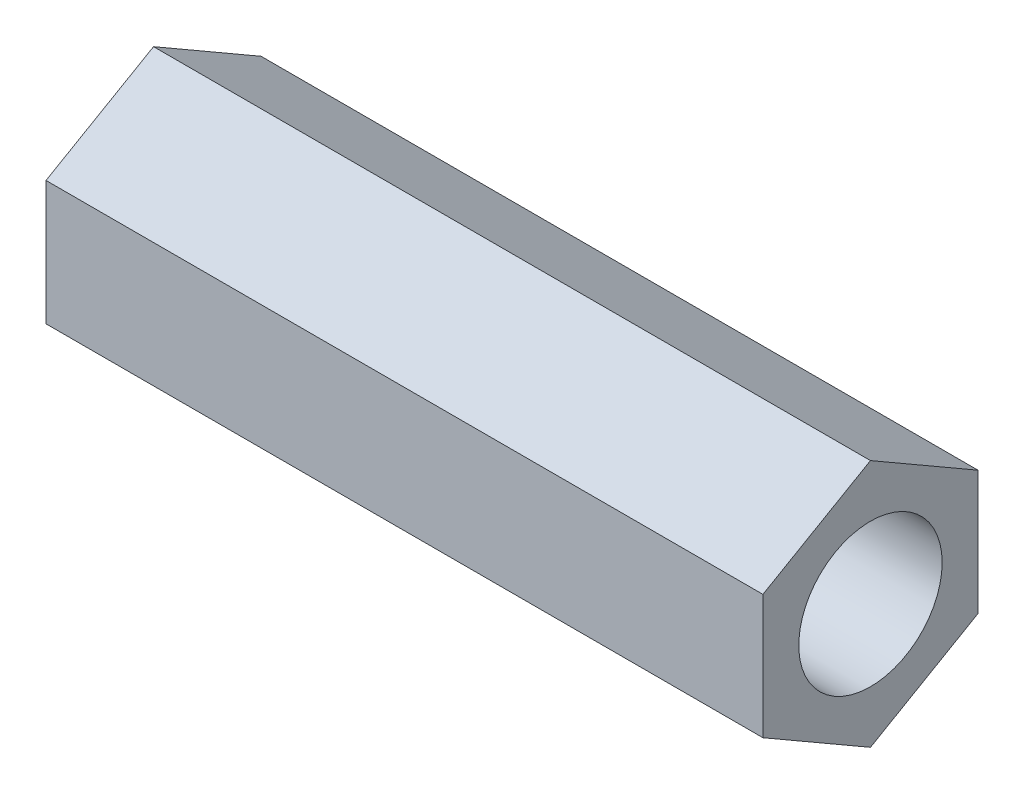
ISO-10303-21;
HEADER;
FILE_DESCRIPTION(('STEP AP214'),'2;1');
FILE_NAME('part.step','',(''),(''),'','','');
FILE_SCHEMA(('AUTOMOTIVE_DESIGN { 1 0 10303 214 1 1 1 1 }'));
ENDSEC;
DATA;
#1=APPLICATION_CONTEXT('core data for automotive mechanical design processes');
#2=APPLICATION_PROTOCOL_DEFINITION('international standard','automotive_design',2000,#1);
#3=PRODUCT_CONTEXT('',#1,'mechanical');
#4=PRODUCT('Part','Part','',(#3));
#5=PRODUCT_RELATED_PRODUCT_CATEGORY('part','',(#4));
#6=PRODUCT_DEFINITION_FORMATION('','',#4);
#7=PRODUCT_DEFINITION_CONTEXT('part definition',#1,'design');
#8=PRODUCT_DEFINITION('design','',#6,#7);
#9=PRODUCT_DEFINITION_SHAPE('','',#8);
#10=(LENGTH_UNIT() NAMED_UNIT(*) SI_UNIT(.MILLI.,.METRE.));
#11=(NAMED_UNIT(*) PLANE_ANGLE_UNIT() SI_UNIT($,.RADIAN.));
#12=(NAMED_UNIT(*) SI_UNIT($,.STERADIAN.) SOLID_ANGLE_UNIT());
#13=UNCERTAINTY_MEASURE_WITH_UNIT(LENGTH_MEASURE(1.E-05),#10,'distance_accuracy_value','');
#14=(GEOMETRIC_REPRESENTATION_CONTEXT(3) GLOBAL_UNCERTAINTY_ASSIGNED_CONTEXT((#13)) GLOBAL_UNIT_ASSIGNED_CONTEXT((#10,
#11,#12)) REPRESENTATION_CONTEXT('',''));
#15=CARTESIAN_POINT('',(0.,0.,0.));
#16=DIRECTION('',(0.,0.,1.));
#17=DIRECTION('',(1.,0.,0.));
#18=AXIS2_PLACEMENT_3D('',#15,#16,#17);
#19=CARTESIAN_POINT('',(20.,0.,0.));
#20=DIRECTION('',(1.,0.,0.));
#21=DIRECTION('',(0.,0.,-1.));
#22=AXIS2_PLACEMENT_3D('',#19,#20,#21);
#23=PLANE('',#22);
#24=DIRECTION('',(0.,0.5,0.866025403784439));
#25=VECTOR('',#24,1.);
#26=CARTESIAN_POINT('',(20.,1.73205080756888,-3.));
#27=LINE('',#26,#25);
#28=CARTESIAN_POINT('',(20.,1.73205080756888,-3.));
#29=VERTEX_POINT('',#28);
#30=CARTESIAN_POINT('',(20.,3.46410161513776,0.));
#31=VERTEX_POINT('',#30);
#32=EDGE_CURVE('E128',#29,#31,#27,.T.);
#33=ORIENTED_EDGE('',*,*,#32,.T.);
#34=DIRECTION('',(0.,-0.5,0.866025403784439));
#35=VECTOR('',#34,1.);
#36=CARTESIAN_POINT('',(20.,3.46410161513776,0.));
#37=LINE('',#36,#35);
#38=CARTESIAN_POINT('',(20.,1.73205080756888,3.));
#39=VERTEX_POINT('',#38);
#40=EDGE_CURVE('E86',#31,#39,#37,.T.);
#41=ORIENTED_EDGE('',*,*,#40,.T.);
#42=DIRECTION('',(0.,-1.,0.));
#43=VECTOR('',#42,1.);
#44=CARTESIAN_POINT('',(20.,1.73205080756888,3.));
#45=LINE('',#44,#43);
#46=CARTESIAN_POINT('',(20.,-1.73205080756888,3.));
#47=VERTEX_POINT('',#46);
#48=EDGE_CURVE('E99',#39,#47,#45,.T.);
#49=ORIENTED_EDGE('',*,*,#48,.T.);
#50=DIRECTION('',(0.,-0.5,-0.866025403784439));
#51=VECTOR('',#50,1.);
#52=CARTESIAN_POINT('',(20.,-1.73205080756888,3.));
#53=LINE('',#52,#51);
#54=CARTESIAN_POINT('',(20.,-3.46410161513776,0.));
#55=VERTEX_POINT('',#54);
#56=EDGE_CURVE('E93',#47,#55,#53,.T.);
#57=ORIENTED_EDGE('',*,*,#56,.T.);
#58=DIRECTION('',(0.,0.5,-0.866025403784439));
#59=VECTOR('',#58,1.);
#60=CARTESIAN_POINT('',(20.,-3.46410161513776,0.));
#61=LINE('',#60,#59);
#62=CARTESIAN_POINT('',(20.,-1.73205080756888,-3.));
#63=VERTEX_POINT('',#62);
#64=EDGE_CURVE('E97',#55,#63,#61,.T.);
#65=ORIENTED_EDGE('',*,*,#64,.T.);
#66=DIRECTION('',(0.,1.,0.));
#67=VECTOR('',#66,1.);
#68=CARTESIAN_POINT('',(20.,-1.73205080756888,-3.));
#69=LINE('',#68,#67);
#70=EDGE_CURVE('E49',#63,#29,#69,.T.);
#71=ORIENTED_EDGE('',*,*,#70,.T.);
#72=EDGE_LOOP('',(#33,#41,#49,#57,#65,#71));
#73=FACE_BOUND('',#72,.T.);
#74=CARTESIAN_POINT('',(20.,0.,0.));
#75=DIRECTION('',(1.,0.,0.));
#76=DIRECTION('',(0.,0.,-1.));
#77=AXIS2_PLACEMENT_3D('',#74,#75,#76);
#78=CIRCLE('',#77,2.);
#79=CARTESIAN_POINT('',(20.,0.,-2.));
#80=VERTEX_POINT('',#79);
#81=EDGE_CURVE('E121',#80,#80,#78,.T.);
#82=ORIENTED_EDGE('',*,*,#81,.F.);
#83=EDGE_LOOP('',(#82));
#84=FACE_BOUND('',#83,.T.);
#85=ADVANCED_FACE('F32',(#73,#84),#23,.T.);
#86=CARTESIAN_POINT('',(0.,0.,0.));
#87=DIRECTION('',(1.,0.,0.));
#88=DIRECTION('',(0.,0.,-1.));
#89=AXIS2_PLACEMENT_3D('',#86,#87,#88);
#90=PLANE('',#89);
#91=DIRECTION('',(0.,0.5,0.866025403784439));
#92=VECTOR('',#91,1.);
#93=CARTESIAN_POINT('',(0.,1.73205080756888,-3.));
#94=LINE('',#93,#92);
#95=CARTESIAN_POINT('',(0.,1.73205080756888,-3.));
#96=VERTEX_POINT('',#95);
#97=CARTESIAN_POINT('',(0.,3.46410161513776,0.));
#98=VERTEX_POINT('',#97);
#99=EDGE_CURVE('E117',#96,#98,#94,.T.);
#100=ORIENTED_EDGE('',*,*,#99,.F.);
#101=DIRECTION('',(0.,1.,0.));
#102=VECTOR('',#101,1.);
#103=CARTESIAN_POINT('',(0.,-1.73205080756888,-3.));
#104=LINE('',#103,#102);
#105=CARTESIAN_POINT('',(0.,-1.73205080756888,-3.));
#106=VERTEX_POINT('',#105);
#107=EDGE_CURVE('E78',#106,#96,#104,.T.);
#108=ORIENTED_EDGE('',*,*,#107,.F.);
#109=DIRECTION('',(0.,0.5,-0.866025403784439));
#110=VECTOR('',#109,1.);
#111=CARTESIAN_POINT('',(0.,-3.46410161513776,0.));
#112=LINE('',#111,#110);
#113=CARTESIAN_POINT('',(0.,-3.46410161513776,0.));
#114=VERTEX_POINT('',#113);
#115=EDGE_CURVE('E72',#114,#106,#112,.T.);
#116=ORIENTED_EDGE('',*,*,#115,.F.);
#117=DIRECTION('',(0.,-0.5,-0.866025403784439));
#118=VECTOR('',#117,1.);
#119=CARTESIAN_POINT('',(0.,-1.73205080756888,3.));
#120=LINE('',#119,#118);
#121=CARTESIAN_POINT('',(0.,-1.73205080756888,3.));
#122=VERTEX_POINT('',#121);
#123=EDGE_CURVE('E107',#122,#114,#120,.T.);
#124=ORIENTED_EDGE('',*,*,#123,.F.);
#125=DIRECTION('',(0.,-1.,0.));
#126=VECTOR('',#125,1.);
#127=CARTESIAN_POINT('',(0.,1.73205080756888,3.));
#128=LINE('',#127,#126);
#129=CARTESIAN_POINT('',(0.,1.73205080756888,3.));
#130=VERTEX_POINT('',#129);
#131=EDGE_CURVE('E123',#130,#122,#128,.T.);
#132=ORIENTED_EDGE('',*,*,#131,.F.);
#133=DIRECTION('',(0.,-0.5,0.866025403784439));
#134=VECTOR('',#133,1.);
#135=CARTESIAN_POINT('',(0.,3.46410161513776,0.));
#136=LINE('',#135,#134);
#137=EDGE_CURVE('E120',#98,#130,#136,.T.);
#138=ORIENTED_EDGE('',*,*,#137,.F.);
#139=EDGE_LOOP('',(#100,#108,#116,#124,#132,#138));
#140=FACE_BOUND('',#139,.T.);
#141=CARTESIAN_POINT('',(0.,0.,0.));
#142=DIRECTION('',(1.,0.,0.));
#143=DIRECTION('',(0.,0.,-1.));
#144=AXIS2_PLACEMENT_3D('',#141,#142,#143);
#145=CIRCLE('',#144,2.);
#146=CARTESIAN_POINT('',(0.,0.,-2.));
#147=VERTEX_POINT('',#146);
#148=EDGE_CURVE('E221',#147,#147,#145,.T.);
#149=ORIENTED_EDGE('',*,*,#148,.T.);
#150=EDGE_LOOP('',(#149));
#151=FACE_BOUND('',#150,.T.);
#152=ADVANCED_FACE('F137',(#140,#151),#90,.F.);
#153=CARTESIAN_POINT('',(20.,1.73205080756888,-3.));
#154=DIRECTION('',(0.,-0.866025403784439,0.5));
#155=DIRECTION('',(0.,-0.5,-0.866025403784439));
#156=AXIS2_PLACEMENT_3D('',#153,#154,#155);
#157=PLANE('',#156);
#158=ORIENTED_EDGE('',*,*,#99,.T.);
#159=DIRECTION('',(-1.,0.,0.));
#160=VECTOR('',#159,1.);
#161=CARTESIAN_POINT('',(20.,3.46410161513776,0.));
#162=LINE('',#161,#160);
#163=EDGE_CURVE('E11',#31,#98,#162,.T.);
#164=ORIENTED_EDGE('',*,*,#163,.F.);
#165=ORIENTED_EDGE('',*,*,#32,.F.);
#166=DIRECTION('',(-1.,0.,0.));
#167=VECTOR('',#166,1.);
#168=CARTESIAN_POINT('',(20.,1.73205080756888,-3.));
#169=LINE('',#168,#167);
#170=EDGE_CURVE('E113',#29,#96,#169,.T.);
#171=ORIENTED_EDGE('',*,*,#170,.T.);
#172=EDGE_LOOP('',(#158,#164,#165,#171));
#173=FACE_BOUND('',#172,.T.);
#174=ADVANCED_FACE('F34',(#173),#157,.F.);
#175=CARTESIAN_POINT('',(20.,3.46410161513776,0.));
#176=DIRECTION('',(0.,-0.866025403784439,-0.5));
#177=DIRECTION('',(0.,0.5,-0.866025403784439));
#178=AXIS2_PLACEMENT_3D('',#175,#176,#177);
#179=PLANE('',#178);
#180=ORIENTED_EDGE('',*,*,#137,.T.);
#181=DIRECTION('',(-1.,0.,0.));
#182=VECTOR('',#181,1.);
#183=CARTESIAN_POINT('',(20.,1.73205080756888,3.));
#184=LINE('',#183,#182);
#185=EDGE_CURVE('E41',#39,#130,#184,.T.);
#186=ORIENTED_EDGE('',*,*,#185,.F.);
#187=ORIENTED_EDGE('',*,*,#40,.F.);
#188=ORIENTED_EDGE('',*,*,#163,.T.);
#189=EDGE_LOOP('',(#180,#186,#187,#188));
#190=FACE_BOUND('',#189,.T.);
#191=ADVANCED_FACE('F162',(#190),#179,.F.);
#192=CARTESIAN_POINT('',(20.,1.73205080756888,3.));
#193=DIRECTION('',(0.,0.,-1.));
#194=DIRECTION('',(0.,1.,0.));
#195=AXIS2_PLACEMENT_3D('',#192,#193,#194);
#196=PLANE('',#195);
#197=ORIENTED_EDGE('',*,*,#131,.T.);
#198=DIRECTION('',(-1.,0.,0.));
#199=VECTOR('',#198,1.);
#200=CARTESIAN_POINT('',(20.,-1.73205080756888,3.));
#201=LINE('',#200,#199);
#202=EDGE_CURVE('E108',#47,#122,#201,.T.);
#203=ORIENTED_EDGE('',*,*,#202,.F.);
#204=ORIENTED_EDGE('',*,*,#48,.F.);
#205=ORIENTED_EDGE('',*,*,#185,.T.);
#206=EDGE_LOOP('',(#197,#203,#204,#205));
#207=FACE_BOUND('',#206,.T.);
#208=ADVANCED_FACE('F134',(#207),#196,.F.);
#209=CARTESIAN_POINT('',(20.,-1.73205080756888,3.));
#210=DIRECTION('',(0.,0.866025403784439,-0.5));
#211=DIRECTION('',(0.,0.5,0.866025403784439));
#212=AXIS2_PLACEMENT_3D('',#209,#210,#211);
#213=PLANE('',#212);
#214=ORIENTED_EDGE('',*,*,#123,.T.);
#215=DIRECTION('',(-1.,0.,0.));
#216=VECTOR('',#215,1.);
#217=CARTESIAN_POINT('',(20.,-3.46410161513776,0.));
#218=LINE('',#217,#216);
#219=EDGE_CURVE('E104',#55,#114,#218,.T.);
#220=ORIENTED_EDGE('',*,*,#219,.F.);
#221=ORIENTED_EDGE('',*,*,#56,.F.);
#222=ORIENTED_EDGE('',*,*,#202,.T.);
#223=EDGE_LOOP('',(#214,#220,#221,#222));
#224=FACE_BOUND('',#223,.T.);
#225=ADVANCED_FACE('F105',(#224),#213,.F.);
#226=CARTESIAN_POINT('',(20.,-3.46410161513776,0.));
#227=DIRECTION('',(0.,0.866025403784439,0.5));
#228=DIRECTION('',(0.,-0.5,0.866025403784439));
#229=AXIS2_PLACEMENT_3D('',#226,#227,#228);
#230=PLANE('',#229);
#231=ORIENTED_EDGE('',*,*,#115,.T.);
#232=DIRECTION('',(-1.,0.,0.));
#233=VECTOR('',#232,1.);
#234=CARTESIAN_POINT('',(20.,-1.73205080756888,-3.));
#235=LINE('',#234,#233);
#236=EDGE_CURVE('E109',#63,#106,#235,.T.);
#237=ORIENTED_EDGE('',*,*,#236,.F.);
#238=ORIENTED_EDGE('',*,*,#64,.F.);
#239=ORIENTED_EDGE('',*,*,#219,.T.);
#240=EDGE_LOOP('',(#231,#237,#238,#239));
#241=FACE_BOUND('',#240,.T.);
#242=ADVANCED_FACE('F111',(#241),#230,.F.);
#243=CARTESIAN_POINT('',(20.,-1.73205080756888,-3.));
#244=DIRECTION('',(0.,0.,1.));
#245=DIRECTION('',(0.,-1.,0.));
#246=AXIS2_PLACEMENT_3D('',#243,#244,#245);
#247=PLANE('',#246);
#248=ORIENTED_EDGE('',*,*,#107,.T.);
#249=ORIENTED_EDGE('',*,*,#170,.F.);
#250=ORIENTED_EDGE('',*,*,#70,.F.);
#251=ORIENTED_EDGE('',*,*,#236,.T.);
#252=EDGE_LOOP('',(#248,#249,#250,#251));
#253=FACE_BOUND('',#252,.T.);
#254=ADVANCED_FACE('F142',(#253),#247,.F.);
#255=CARTESIAN_POINT('',(20.,0.,0.));
#256=DIRECTION('',(-1.,0.,0.));
#257=DIRECTION('',(0.,0.,1.));
#258=AXIS2_PLACEMENT_3D('',#255,#256,#257);
#259=CYLINDRICAL_SURFACE('',#258,2.);
#260=ORIENTED_EDGE('',*,*,#81,.T.);
#261=EDGE_LOOP('',(#260));
#262=FACE_BOUND('',#261,.T.);
#263=ORIENTED_EDGE('',*,*,#148,.F.);
#264=EDGE_LOOP('',(#263));
#265=FACE_BOUND('',#264,.T.);
#266=ADVANCED_FACE('F144',(#262,#265),#259,.F.);
#267=CLOSED_SHELL('',(#85,#152,#174,#191,#208,#225,#242,#254,#266));
#268=MANIFOLD_SOLID_BREP('B2',#267);
#269=ADVANCED_BREP_SHAPE_REPRESENTATION('',(#18,#268),#14);
#270=SHAPE_DEFINITION_REPRESENTATION(#9,#269);
ENDSEC;
END-ISO-10303-21;
